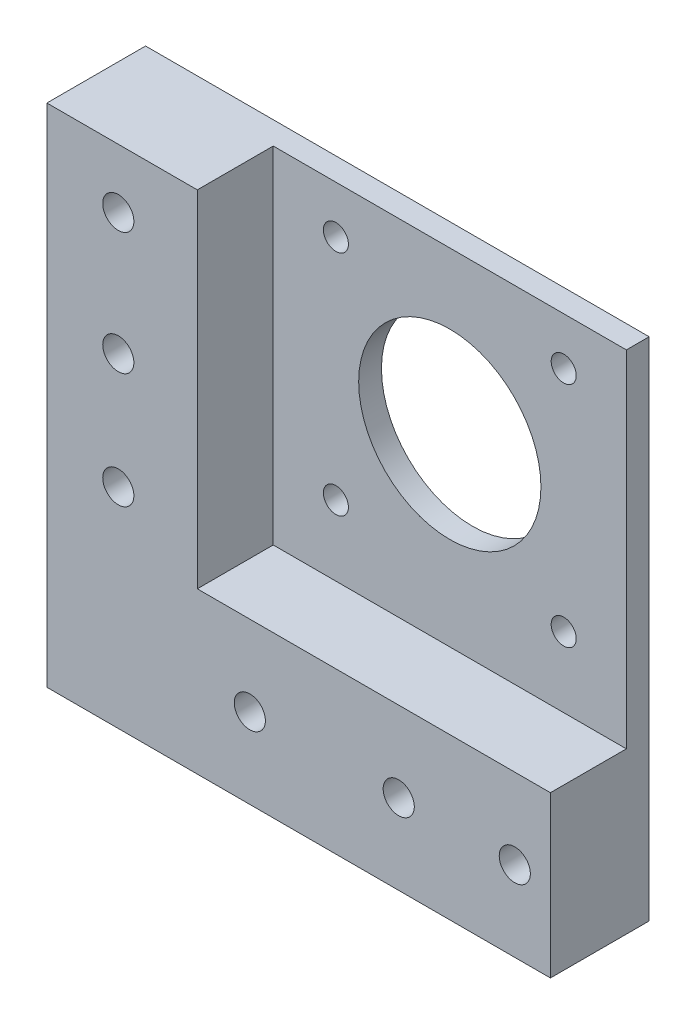
ISO-10303-21;
HEADER;
FILE_DESCRIPTION(('STEP AP214'),'2;1');
FILE_NAME('part.step','',(''),(''),'','','');
FILE_SCHEMA(('AUTOMOTIVE_DESIGN { 1 0 10303 214 1 1 1 1 }'));
ENDSEC;
DATA;
#1=APPLICATION_CONTEXT('core data for automotive mechanical design processes');
#2=APPLICATION_PROTOCOL_DEFINITION('international standard','automotive_design',2000,#1);
#3=PRODUCT_CONTEXT('',#1,'mechanical');
#4=PRODUCT('Part','Part','',(#3));
#5=PRODUCT_RELATED_PRODUCT_CATEGORY('part','',(#4));
#6=PRODUCT_DEFINITION_FORMATION('','',#4);
#7=PRODUCT_DEFINITION_CONTEXT('part definition',#1,'design');
#8=PRODUCT_DEFINITION('design','',#6,#7);
#9=PRODUCT_DEFINITION_SHAPE('','',#8);
#10=(LENGTH_UNIT() NAMED_UNIT(*) SI_UNIT(.MILLI.,.METRE.));
#11=(NAMED_UNIT(*) PLANE_ANGLE_UNIT() SI_UNIT($,.RADIAN.));
#12=(NAMED_UNIT(*) SI_UNIT($,.STERADIAN.) SOLID_ANGLE_UNIT());
#13=UNCERTAINTY_MEASURE_WITH_UNIT(LENGTH_MEASURE(1.E-05),#10,'distance_accuracy_value','');
#14=(GEOMETRIC_REPRESENTATION_CONTEXT(3) GLOBAL_UNCERTAINTY_ASSIGNED_CONTEXT((#13)) GLOBAL_UNIT_ASSIGNED_CONTEXT((#10,
#11,#12)) REPRESENTATION_CONTEXT('',''));
#15=CARTESIAN_POINT('',(0.,0.,0.));
#16=DIRECTION('',(0.,0.,1.));
#17=DIRECTION('',(1.,0.,0.));
#18=AXIS2_PLACEMENT_3D('',#15,#16,#17);
#19=CARTESIAN_POINT('',(0.,3.,0.));
#20=DIRECTION('',(1.,0.,0.));
#21=DIRECTION('',(0.,0.,1.));
#22=AXIS2_PLACEMENT_3D('',#19,#20,#21);
#23=PLANE('',#22);
#24=DIRECTION('',(0.,0.,1.));
#25=VECTOR('',#24,1.);
#26=CARTESIAN_POINT('',(0.,45.5,0.));
#27=LINE('',#26,#25);
#28=CARTESIAN_POINT('',(0.,45.5,-3.));
#29=VERTEX_POINT('',#28);
#30=CARTESIAN_POINT('',(0.,45.5,0.));
#31=VERTEX_POINT('',#30);
#32=EDGE_CURVE('E111',#29,#31,#27,.T.);
#33=ORIENTED_EDGE('',*,*,#32,.T.);
#34=DIRECTION('',(0.,-1.,0.));
#35=VECTOR('',#34,1.);
#36=CARTESIAN_POINT('',(0.,3.,0.));
#37=LINE('',#36,#35);
#38=CARTESIAN_POINT('',(0.,0.,0.));
#39=VERTEX_POINT('',#38);
#40=EDGE_CURVE('E11',#31,#39,#37,.T.);
#41=ORIENTED_EDGE('',*,*,#40,.T.);
#42=DIRECTION('',(0.,0.,1.));
#43=VECTOR('',#42,1.);
#44=CARTESIAN_POINT('',(0.,0.,-3.));
#45=LINE('',#44,#43);
#46=CARTESIAN_POINT('',(0.,0.,10.));
#47=VERTEX_POINT('',#46);
#48=EDGE_CURVE('E176',#39,#47,#45,.T.);
#49=ORIENTED_EDGE('',*,*,#48,.T.);
#50=DIRECTION('',(0.,-1.,0.));
#51=VECTOR('',#50,1.);
#52=CARTESIAN_POINT('',(0.,0.,10.));
#53=LINE('',#52,#51);
#54=CARTESIAN_POINT('',(0.,-21.1335669329671,10.));
#55=VERTEX_POINT('',#54);
#56=EDGE_CURVE('E206',#47,#55,#53,.T.);
#57=ORIENTED_EDGE('',*,*,#56,.T.);
#58=DIRECTION('',(0.,0.,1.));
#59=VECTOR('',#58,1.);
#60=CARTESIAN_POINT('',(0.,-21.1335669329671,-3.));
#61=LINE('',#60,#59);
#62=CARTESIAN_POINT('',(0.,-21.1335669329671,-3.));
#63=VERTEX_POINT('',#62);
#64=EDGE_CURVE('E113',#63,#55,#61,.T.);
#65=ORIENTED_EDGE('',*,*,#64,.F.);
#66=DIRECTION('',(0.,-1.,0.));
#67=VECTOR('',#66,1.);
#68=CARTESIAN_POINT('',(0.,0.,-3.));
#69=LINE('',#68,#67);
#70=EDGE_CURVE('E102',#29,#63,#69,.T.);
#71=ORIENTED_EDGE('',*,*,#70,.F.);
#72=EDGE_LOOP('',(#33,#41,#49,#57,#65,#71));
#73=FACE_BOUND('',#72,.T.);
#74=ADVANCED_FACE('F39',(#73),#23,.T.);
#75=CARTESIAN_POINT('',(0.,45.5,0.));
#76=DIRECTION('',(0.,1.,0.));
#77=DIRECTION('',(0.,0.,1.));
#78=AXIS2_PLACEMENT_3D('',#75,#76,#77);
#79=PLANE('',#78);
#80=DIRECTION('',(0.,0.,1.));
#81=VECTOR('',#80,1.);
#82=CARTESIAN_POINT('',(-66.3112991356769,45.5,-3.));
#83=LINE('',#82,#81);
#84=CARTESIAN_POINT('',(-66.3112991356769,45.5,-3.));
#85=VERTEX_POINT('',#84);
#86=CARTESIAN_POINT('',(-66.3112991356769,45.5,10.));
#87=VERTEX_POINT('',#86);
#88=EDGE_CURVE('E133',#85,#87,#83,.T.);
#89=ORIENTED_EDGE('',*,*,#88,.T.);
#90=DIRECTION('',(-1.,0.,0.));
#91=VECTOR('',#90,1.);
#92=CARTESIAN_POINT('',(0.,45.5,10.));
#93=LINE('',#92,#91);
#94=CARTESIAN_POINT('',(-46.5,45.5,10.));
#95=VERTEX_POINT('',#94);
#96=EDGE_CURVE('E213',#95,#87,#93,.T.);
#97=ORIENTED_EDGE('',*,*,#96,.F.);
#98=DIRECTION('',(0.,0.,1.));
#99=VECTOR('',#98,1.);
#100=CARTESIAN_POINT('',(-46.5,45.5,-3.));
#101=LINE('',#100,#99);
#102=CARTESIAN_POINT('',(-46.5,45.5,0.));
#103=VERTEX_POINT('',#102);
#104=EDGE_CURVE('E180',#103,#95,#101,.T.);
#105=ORIENTED_EDGE('',*,*,#104,.F.);
#106=DIRECTION('',(-1.,0.,0.));
#107=VECTOR('',#106,1.);
#108=CARTESIAN_POINT('',(0.,45.5,0.));
#109=LINE('',#108,#107);
#110=EDGE_CURVE('E46',#31,#103,#109,.T.);
#111=ORIENTED_EDGE('',*,*,#110,.F.);
#112=ORIENTED_EDGE('',*,*,#32,.F.);
#113=DIRECTION('',(-1.,0.,0.));
#114=VECTOR('',#113,1.);
#115=CARTESIAN_POINT('',(0.,45.5,-3.));
#116=LINE('',#115,#114);
#117=EDGE_CURVE('E98',#29,#85,#116,.T.);
#118=ORIENTED_EDGE('',*,*,#117,.T.);
#119=EDGE_LOOP('',(#89,#97,#105,#111,#112,#118));
#120=FACE_BOUND('',#119,.T.);
#121=ADVANCED_FACE('F115',(#120),#79,.T.);
#122=CARTESIAN_POINT('',(0.,3.,0.));
#123=DIRECTION('',(0.,0.,1.));
#124=DIRECTION('',(-1.,0.,0.));
#125=AXIS2_PLACEMENT_3D('',#122,#123,#124);
#126=PLANE('',#125);
#127=CARTESIAN_POINT('',(-8.25000000000007,9.24999999999999,0.));
#128=DIRECTION('',(0.,0.,-1.));
#129=DIRECTION('',(-1.,0.,0.));
#130=AXIS2_PLACEMENT_3D('',#127,#128,#129);
#131=CIRCLE('',#130,1.65);
#132=CARTESIAN_POINT('',(-9.90000000000007,9.24999999999999,0.));
#133=VERTEX_POINT('',#132);
#134=EDGE_CURVE('E119',#133,#133,#131,.T.);
#135=ORIENTED_EDGE('',*,*,#134,.T.);
#136=EDGE_LOOP('',(#135));
#137=FACE_BOUND('',#136,.T.);
#138=CARTESIAN_POINT('',(-8.25000000000007,39.25,0.));
#139=DIRECTION('',(0.,0.,-1.));
#140=DIRECTION('',(-1.,0.,0.));
#141=AXIS2_PLACEMENT_3D('',#138,#139,#140);
#142=CIRCLE('',#141,1.65);
#143=CARTESIAN_POINT('',(-9.90000000000007,39.25,0.));
#144=VERTEX_POINT('',#143);
#145=EDGE_CURVE('E128',#144,#144,#142,.T.);
#146=ORIENTED_EDGE('',*,*,#145,.T.);
#147=EDGE_LOOP('',(#146));
#148=FACE_BOUND('',#147,.T.);
#149=CARTESIAN_POINT('',(-38.25,39.25,0.));
#150=DIRECTION('',(0.,0.,-1.));
#151=DIRECTION('',(-1.,0.,0.));
#152=AXIS2_PLACEMENT_3D('',#149,#150,#151);
#153=CIRCLE('',#152,1.65);
#154=CARTESIAN_POINT('',(-39.9,39.25,0.));
#155=VERTEX_POINT('',#154);
#156=EDGE_CURVE('E125',#155,#155,#153,.T.);
#157=ORIENTED_EDGE('',*,*,#156,.T.);
#158=EDGE_LOOP('',(#157));
#159=FACE_BOUND('',#158,.T.);
#160=CARTESIAN_POINT('',(-38.2500000000001,9.24999999999999,0.));
#161=DIRECTION('',(0.,0.,-1.));
#162=DIRECTION('',(-1.,0.,0.));
#163=AXIS2_PLACEMENT_3D('',#160,#161,#162);
#164=CIRCLE('',#163,1.65);
#165=CARTESIAN_POINT('',(-39.9000000000001,9.24999999999999,0.));
#166=VERTEX_POINT('',#165);
#167=EDGE_CURVE('E122',#166,#166,#164,.T.);
#168=ORIENTED_EDGE('',*,*,#167,.T.);
#169=EDGE_LOOP('',(#168));
#170=FACE_BOUND('',#169,.T.);
#171=CARTESIAN_POINT('',(-23.25,24.25,0.));
#172=DIRECTION('',(0.,0.,-1.));
#173=DIRECTION('',(-1.,0.,0.));
#174=AXIS2_PLACEMENT_3D('',#171,#172,#173);
#175=CIRCLE('',#174,12.);
#176=CARTESIAN_POINT('',(-35.25,24.25,0.));
#177=VERTEX_POINT('',#176);
#178=EDGE_CURVE('E116',#177,#177,#175,.T.);
#179=ORIENTED_EDGE('',*,*,#178,.T.);
#180=EDGE_LOOP('',(#179));
#181=FACE_BOUND('',#180,.T.);
#182=ORIENTED_EDGE('',*,*,#40,.F.);
#183=ORIENTED_EDGE('',*,*,#110,.T.);
#184=DIRECTION('',(0.,1.,0.));
#185=VECTOR('',#184,1.);
#186=CARTESIAN_POINT('',(-46.5,3.,0.));
#187=LINE('',#186,#185);
#188=CARTESIAN_POINT('',(-46.5,0.,0.));
#189=VERTEX_POINT('',#188);
#190=EDGE_CURVE('E174',#189,#103,#187,.T.);
#191=ORIENTED_EDGE('',*,*,#190,.F.);
#192=DIRECTION('',(-1.,0.,0.));
#193=VECTOR('',#192,1.);
#194=CARTESIAN_POINT('',(0.,0.,0.));
#195=LINE('',#194,#193);
#196=EDGE_CURVE('E171',#39,#189,#195,.T.);
#197=ORIENTED_EDGE('',*,*,#196,.F.);
#198=EDGE_LOOP('',(#182,#183,#191,#197));
#199=FACE_BOUND('',#198,.T.);
#200=ADVANCED_FACE('F232',(#137,#148,#159,#170,#181,#199),#126,.T.);
#201=CARTESIAN_POINT('',(-23.25,24.25,-40.));
#202=DIRECTION('',(0.,0.,1.));
#203=DIRECTION('',(-1.,0.,0.));
#204=AXIS2_PLACEMENT_3D('',#201,#202,#203);
#205=CYLINDRICAL_SURFACE('',#204,12.);
#206=ORIENTED_EDGE('',*,*,#178,.F.);
#207=EDGE_LOOP('',(#206));
#208=FACE_BOUND('',#207,.T.);
#209=CARTESIAN_POINT('',(-23.25,24.25,-3.));
#210=DIRECTION('',(0.,0.,-1.));
#211=DIRECTION('',(-1.,0.,0.));
#212=AXIS2_PLACEMENT_3D('',#209,#210,#211);
#213=CIRCLE('',#212,12.);
#214=CARTESIAN_POINT('',(-35.25,24.25,-3.));
#215=VERTEX_POINT('',#214);
#216=EDGE_CURVE('E151',#215,#215,#213,.F.);
#217=ORIENTED_EDGE('',*,*,#216,.F.);
#218=EDGE_LOOP('',(#217));
#219=FACE_BOUND('',#218,.T.);
#220=ADVANCED_FACE('F256',(#208,#219),#205,.F.);
#221=CARTESIAN_POINT('',(-38.2500000000001,9.24999999999999,-40.));
#222=DIRECTION('',(0.,0.,1.));
#223=DIRECTION('',(-1.,0.,0.));
#224=AXIS2_PLACEMENT_3D('',#221,#222,#223);
#225=CYLINDRICAL_SURFACE('',#224,1.65);
#226=ORIENTED_EDGE('',*,*,#167,.F.);
#227=EDGE_LOOP('',(#226));
#228=FACE_BOUND('',#227,.T.);
#229=CARTESIAN_POINT('',(-38.2500000000001,9.24999999999999,-3.));
#230=DIRECTION('',(0.,0.,-1.));
#231=DIRECTION('',(-1.,0.,0.));
#232=AXIS2_PLACEMENT_3D('',#229,#230,#231);
#233=CIRCLE('',#232,1.65);
#234=CARTESIAN_POINT('',(-39.9000000000001,9.24999999999999,-3.));
#235=VERTEX_POINT('',#234);
#236=EDGE_CURVE('E154',#235,#235,#233,.F.);
#237=ORIENTED_EDGE('',*,*,#236,.F.);
#238=EDGE_LOOP('',(#237));
#239=FACE_BOUND('',#238,.T.);
#240=ADVANCED_FACE('F261',(#228,#239),#225,.F.);
#241=CARTESIAN_POINT('',(-38.25,39.25,-40.));
#242=DIRECTION('',(0.,0.,1.));
#243=DIRECTION('',(-1.,0.,0.));
#244=AXIS2_PLACEMENT_3D('',#241,#242,#243);
#245=CYLINDRICAL_SURFACE('',#244,1.65);
#246=ORIENTED_EDGE('',*,*,#156,.F.);
#247=EDGE_LOOP('',(#246));
#248=FACE_BOUND('',#247,.T.);
#249=CARTESIAN_POINT('',(-38.25,39.25,-3.));
#250=DIRECTION('',(0.,0.,-1.));
#251=DIRECTION('',(-1.,0.,0.));
#252=AXIS2_PLACEMENT_3D('',#249,#250,#251);
#253=CIRCLE('',#252,1.65);
#254=CARTESIAN_POINT('',(-39.9,39.25,-3.));
#255=VERTEX_POINT('',#254);
#256=EDGE_CURVE('E148',#255,#255,#253,.F.);
#257=ORIENTED_EDGE('',*,*,#256,.F.);
#258=EDGE_LOOP('',(#257));
#259=FACE_BOUND('',#258,.T.);
#260=ADVANCED_FACE('F265',(#248,#259),#245,.F.);
#261=CARTESIAN_POINT('',(-8.25000000000007,39.25,-40.));
#262=DIRECTION('',(0.,0.,1.));
#263=DIRECTION('',(-1.,0.,0.));
#264=AXIS2_PLACEMENT_3D('',#261,#262,#263);
#265=CYLINDRICAL_SURFACE('',#264,1.65);
#266=ORIENTED_EDGE('',*,*,#145,.F.);
#267=EDGE_LOOP('',(#266));
#268=FACE_BOUND('',#267,.T.);
#269=CARTESIAN_POINT('',(-8.25000000000007,39.25,-3.));
#270=DIRECTION('',(0.,0.,-1.));
#271=DIRECTION('',(-1.,0.,0.));
#272=AXIS2_PLACEMENT_3D('',#269,#270,#271);
#273=CIRCLE('',#272,1.65);
#274=CARTESIAN_POINT('',(-9.90000000000007,39.25,-3.));
#275=VERTEX_POINT('',#274);
#276=EDGE_CURVE('E157',#275,#275,#273,.F.);
#277=ORIENTED_EDGE('',*,*,#276,.F.);
#278=EDGE_LOOP('',(#277));
#279=FACE_BOUND('',#278,.T.);
#280=ADVANCED_FACE('F269',(#268,#279),#265,.F.);
#281=CARTESIAN_POINT('',(-8.25000000000007,9.24999999999999,-40.));
#282=DIRECTION('',(0.,0.,1.));
#283=DIRECTION('',(-1.,0.,0.));
#284=AXIS2_PLACEMENT_3D('',#281,#282,#283);
#285=CYLINDRICAL_SURFACE('',#284,1.65);
#286=ORIENTED_EDGE('',*,*,#134,.F.);
#287=EDGE_LOOP('',(#286));
#288=FACE_BOUND('',#287,.T.);
#289=CARTESIAN_POINT('',(-8.25000000000007,9.24999999999999,-3.));
#290=DIRECTION('',(0.,0.,-1.));
#291=DIRECTION('',(-1.,0.,0.));
#292=AXIS2_PLACEMENT_3D('',#289,#290,#291);
#293=CIRCLE('',#292,1.65);
#294=CARTESIAN_POINT('',(-9.90000000000007,9.24999999999999,-3.));
#295=VERTEX_POINT('',#294);
#296=EDGE_CURVE('E145',#295,#295,#293,.F.);
#297=ORIENTED_EDGE('',*,*,#296,.F.);
#298=EDGE_LOOP('',(#297));
#299=FACE_BOUND('',#298,.T.);
#300=ADVANCED_FACE('F273',(#288,#299),#285,.F.);
#301=CARTESIAN_POINT('',(0.,0.,-3.));
#302=DIRECTION('',(0.,0.,1.));
#303=DIRECTION('',(-1.,0.,0.));
#304=AXIS2_PLACEMENT_3D('',#301,#302,#303);
#305=PLANE('',#304);
#306=CARTESIAN_POINT('',(-39.5824358543138,-10.5667834664835,-3.));
#307=DIRECTION('',(0.,0.,-1.));
#308=DIRECTION('',(-1.,0.,0.));
#309=AXIS2_PLACEMENT_3D('',#306,#307,#308);
#310=CIRCLE('',#309,2.04999999999999);
#311=CARTESIAN_POINT('',(-41.6324358543138,-10.5667834664835,-3.));
#312=VERTEX_POINT('',#311);
#313=EDGE_CURVE('E135',#312,#312,#310,.T.);
#314=ORIENTED_EDGE('',*,*,#313,.F.);
#315=EDGE_LOOP('',(#314));
#316=FACE_BOUND('',#315,.T.);
#317=CARTESIAN_POINT('',(-4.69126171678624,-10.5667834664835,-3.));
#318=DIRECTION('',(0.,0.,-1.));
#319=DIRECTION('',(-1.,0.,0.));
#320=AXIS2_PLACEMENT_3D('',#317,#318,#319);
#321=CIRCLE('',#320,2.05);
#322=CARTESIAN_POINT('',(-6.74126171678624,-10.5667834664835,-3.));
#323=VERTEX_POINT('',#322);
#324=EDGE_CURVE('E139',#323,#323,#321,.T.);
#325=ORIENTED_EDGE('',*,*,#324,.F.);
#326=EDGE_LOOP('',(#325));
#327=FACE_BOUND('',#326,.T.);
#328=CARTESIAN_POINT('',(-19.9769249937987,-10.5667834664835,-3.));
#329=DIRECTION('',(0.,0.,-1.));
#330=DIRECTION('',(-1.,0.,0.));
#331=AXIS2_PLACEMENT_3D('',#328,#329,#330);
#332=CIRCLE('',#331,2.05);
#333=CARTESIAN_POINT('',(-22.0269249937987,-10.5667834664835,-3.));
#334=VERTEX_POINT('',#333);
#335=EDGE_CURVE('E142',#334,#334,#332,.T.);
#336=ORIENTED_EDGE('',*,*,#335,.F.);
#337=EDGE_LOOP('',(#336));
#338=FACE_BOUND('',#337,.T.);
#339=ORIENTED_EDGE('',*,*,#70,.T.);
#340=DIRECTION('',(1.,0.,0.));
#341=VECTOR('',#340,1.);
#342=CARTESIAN_POINT('',(0.,-21.1335669329671,-3.));
#343=LINE('',#342,#341);
#344=CARTESIAN_POINT('',(-66.3112991356769,-21.1335669329671,-3.));
#345=VERTEX_POINT('',#344);
#346=EDGE_CURVE('E60',#345,#63,#343,.T.);
#347=ORIENTED_EDGE('',*,*,#346,.F.);
#348=DIRECTION('',(0.,-1.,0.));
#349=VECTOR('',#348,1.);
#350=CARTESIAN_POINT('',(-66.3112991356769,0.,-3.));
#351=LINE('',#350,#349);
#352=EDGE_CURVE('E105',#85,#345,#351,.T.);
#353=ORIENTED_EDGE('',*,*,#352,.F.);
#354=ORIENTED_EDGE('',*,*,#117,.F.);
#355=EDGE_LOOP('',(#339,#347,#353,#354));
#356=FACE_BOUND('',#355,.T.);
#357=CARTESIAN_POINT('',(-56.9030733555991,21.6094458305065,-3.));
#358=DIRECTION('',(0.,0.,-1.));
#359=DIRECTION('',(-1.,0.,0.));
#360=AXIS2_PLACEMENT_3D('',#357,#358,#359);
#361=CIRCLE('',#360,2.04999999999999);
#362=CARTESIAN_POINT('',(-58.9530733555991,21.6094458305065,-3.));
#363=VERTEX_POINT('',#362);
#364=EDGE_CURVE('E168',#363,#363,#361,.T.);
#365=ORIENTED_EDGE('',*,*,#364,.F.);
#366=EDGE_LOOP('',(#365));
#367=FACE_BOUND('',#366,.T.);
#368=CARTESIAN_POINT('',(-56.9030733555991,6.42969754154166,-3.));
#369=DIRECTION('',(0.,0.,-1.));
#370=DIRECTION('',(-1.,0.,0.));
#371=AXIS2_PLACEMENT_3D('',#368,#369,#370);
#372=CIRCLE('',#371,2.04999999999999);
#373=CARTESIAN_POINT('',(-58.9530733555991,6.42969754154166,-3.));
#374=VERTEX_POINT('',#373);
#375=EDGE_CURVE('E165',#374,#374,#372,.T.);
#376=ORIENTED_EDGE('',*,*,#375,.F.);
#377=EDGE_LOOP('',(#376));
#378=FACE_BOUND('',#377,.T.);
#379=CARTESIAN_POINT('',(-56.9030733555991,37.7215889065994,-3.));
#380=DIRECTION('',(0.,0.,-1.));
#381=DIRECTION('',(-1.,0.,0.));
#382=AXIS2_PLACEMENT_3D('',#379,#380,#381);
#383=CIRCLE('',#382,2.04999999999999);
#384=CARTESIAN_POINT('',(-58.9530733555991,37.7215889065994,-3.));
#385=VERTEX_POINT('',#384);
#386=EDGE_CURVE('E162',#385,#385,#383,.T.);
#387=ORIENTED_EDGE('',*,*,#386,.F.);
#388=EDGE_LOOP('',(#387));
#389=FACE_BOUND('',#388,.T.);
#390=ORIENTED_EDGE('',*,*,#296,.T.);
#391=EDGE_LOOP('',(#390));
#392=FACE_BOUND('',#391,.T.);
#393=ORIENTED_EDGE('',*,*,#256,.T.);
#394=EDGE_LOOP('',(#393));
#395=FACE_BOUND('',#394,.T.);
#396=ORIENTED_EDGE('',*,*,#216,.T.);
#397=EDGE_LOOP('',(#396));
#398=FACE_BOUND('',#397,.T.);
#399=ORIENTED_EDGE('',*,*,#236,.T.);
#400=EDGE_LOOP('',(#399));
#401=FACE_BOUND('',#400,.T.);
#402=ORIENTED_EDGE('',*,*,#276,.T.);
#403=EDGE_LOOP('',(#402));
#404=FACE_BOUND('',#403,.T.);
#405=ADVANCED_FACE('F100',(#316,#327,#338,#356,#367,#378,#389,#392,#395,#398,#401,#404),#305,.F.);
#406=CARTESIAN_POINT('',(-66.3112991356769,0.,-3.));
#407=DIRECTION('',(1.,0.,0.));
#408=DIRECTION('',(0.,0.,1.));
#409=AXIS2_PLACEMENT_3D('',#406,#407,#408);
#410=PLANE('',#409);
#411=ORIENTED_EDGE('',*,*,#88,.F.);
#412=ORIENTED_EDGE('',*,*,#352,.T.);
#413=DIRECTION('',(0.,0.,1.));
#414=VECTOR('',#413,1.);
#415=CARTESIAN_POINT('',(-66.3112991356769,-21.1335669329671,-3.));
#416=LINE('',#415,#414);
#417=CARTESIAN_POINT('',(-66.3112991356769,-21.1335669329671,10.));
#418=VERTEX_POINT('',#417);
#419=EDGE_CURVE('E177',#345,#418,#416,.T.);
#420=ORIENTED_EDGE('',*,*,#419,.T.);
#421=DIRECTION('',(0.,1.,0.));
#422=VECTOR('',#421,1.);
#423=CARTESIAN_POINT('',(-66.3112991356769,0.,10.));
#424=LINE('',#423,#422);
#425=EDGE_CURVE('E216',#418,#87,#424,.T.);
#426=ORIENTED_EDGE('',*,*,#425,.T.);
#427=EDGE_LOOP('',(#411,#412,#420,#426));
#428=FACE_BOUND('',#427,.T.);
#429=ADVANCED_FACE('F227',(#428),#410,.F.);
#430=CARTESIAN_POINT('',(0.,-21.1335669329671,-3.));
#431=DIRECTION('',(0.,1.,0.));
#432=DIRECTION('',(0.,0.,1.));
#433=AXIS2_PLACEMENT_3D('',#430,#431,#432);
#434=PLANE('',#433);
#435=DIRECTION('',(-1.,0.,0.));
#436=VECTOR('',#435,1.);
#437=CARTESIAN_POINT('',(0.,-21.1335669329671,10.));
#438=LINE('',#437,#436);
#439=EDGE_CURVE('E218',#55,#418,#438,.T.);
#440=ORIENTED_EDGE('',*,*,#439,.T.);
#441=ORIENTED_EDGE('',*,*,#419,.F.);
#442=ORIENTED_EDGE('',*,*,#346,.T.);
#443=ORIENTED_EDGE('',*,*,#64,.T.);
#444=EDGE_LOOP('',(#440,#441,#442,#443));
#445=FACE_BOUND('',#444,.T.);
#446=ADVANCED_FACE('F220',(#445),#434,.F.);
#447=CARTESIAN_POINT('',(-4.69126171678624,-10.5667834664835,-3.));
#448=DIRECTION('',(0.,0.,1.));
#449=DIRECTION('',(-1.,0.,0.));
#450=AXIS2_PLACEMENT_3D('',#447,#448,#449);
#451=CYLINDRICAL_SURFACE('',#450,2.05);
#452=ORIENTED_EDGE('',*,*,#324,.T.);
#453=EDGE_LOOP('',(#452));
#454=FACE_BOUND('',#453,.T.);
#455=CARTESIAN_POINT('',(-4.69126171678624,-10.5667834664835,10.));
#456=DIRECTION('',(0.,0.,-1.));
#457=DIRECTION('',(-1.,0.,0.));
#458=AXIS2_PLACEMENT_3D('',#455,#456,#457);
#459=CIRCLE('',#458,2.05);
#460=CARTESIAN_POINT('',(-6.74126171678624,-10.5667834664835,10.));
#461=VERTEX_POINT('',#460);
#462=EDGE_CURVE('E200',#461,#461,#459,.T.);
#463=ORIENTED_EDGE('',*,*,#462,.F.);
#464=EDGE_LOOP('',(#463));
#465=FACE_BOUND('',#464,.T.);
#466=ADVANCED_FACE('F294',(#454,#465),#451,.F.);
#467=CARTESIAN_POINT('',(-19.9769249937987,-10.5667834664835,-3.));
#468=DIRECTION('',(0.,0.,1.));
#469=DIRECTION('',(-1.,0.,0.));
#470=AXIS2_PLACEMENT_3D('',#467,#468,#469);
#471=CYLINDRICAL_SURFACE('',#470,2.05);
#472=ORIENTED_EDGE('',*,*,#335,.T.);
#473=EDGE_LOOP('',(#472));
#474=FACE_BOUND('',#473,.T.);
#475=CARTESIAN_POINT('',(-19.9769249937987,-10.5667834664835,10.));
#476=DIRECTION('',(0.,0.,-1.));
#477=DIRECTION('',(-1.,0.,0.));
#478=AXIS2_PLACEMENT_3D('',#475,#476,#477);
#479=CIRCLE('',#478,2.05);
#480=CARTESIAN_POINT('',(-22.0269249937987,-10.5667834664835,10.));
#481=VERTEX_POINT('',#480);
#482=EDGE_CURVE('E203',#481,#481,#479,.T.);
#483=ORIENTED_EDGE('',*,*,#482,.F.);
#484=EDGE_LOOP('',(#483));
#485=FACE_BOUND('',#484,.T.);
#486=ADVANCED_FACE('F288',(#474,#485),#471,.F.);
#487=CARTESIAN_POINT('',(-56.9030733555991,37.7215889065994,-3.));
#488=DIRECTION('',(0.,0.,1.));
#489=DIRECTION('',(-1.,0.,0.));
#490=AXIS2_PLACEMENT_3D('',#487,#488,#489);
#491=CYLINDRICAL_SURFACE('',#490,2.04999999999999);
#492=ORIENTED_EDGE('',*,*,#386,.T.);
#493=EDGE_LOOP('',(#492));
#494=FACE_BOUND('',#493,.T.);
#495=CARTESIAN_POINT('',(-56.9030733555991,37.7215889065994,10.));
#496=DIRECTION('',(0.,0.,-1.));
#497=DIRECTION('',(-1.,0.,0.));
#498=AXIS2_PLACEMENT_3D('',#495,#496,#497);
#499=CIRCLE('',#498,2.04999999999999);
#500=CARTESIAN_POINT('',(-58.9530733555991,37.7215889065994,10.));
#501=VERTEX_POINT('',#500);
#502=EDGE_CURVE('E181',#501,#501,#499,.T.);
#503=ORIENTED_EDGE('',*,*,#502,.F.);
#504=EDGE_LOOP('',(#503));
#505=FACE_BOUND('',#504,.T.);
#506=ADVANCED_FACE('F284',(#494,#505),#491,.F.);
#507=CARTESIAN_POINT('',(-56.9030733555991,6.42969754154166,-3.));
#508=DIRECTION('',(0.,0.,1.));
#509=DIRECTION('',(-1.,0.,0.));
#510=AXIS2_PLACEMENT_3D('',#507,#508,#509);
#511=CYLINDRICAL_SURFACE('',#510,2.04999999999999);
#512=ORIENTED_EDGE('',*,*,#375,.T.);
#513=EDGE_LOOP('',(#512));
#514=FACE_BOUND('',#513,.T.);
#515=CARTESIAN_POINT('',(-56.9030733555991,6.42969754154166,10.));
#516=DIRECTION('',(0.,0.,-1.));
#517=DIRECTION('',(-1.,0.,0.));
#518=AXIS2_PLACEMENT_3D('',#515,#516,#517);
#519=CIRCLE('',#518,2.04999999999999);
#520=CARTESIAN_POINT('',(-58.9530733555991,6.42969754154166,10.));
#521=VERTEX_POINT('',#520);
#522=EDGE_CURVE('E191',#521,#521,#519,.T.);
#523=ORIENTED_EDGE('',*,*,#522,.F.);
#524=EDGE_LOOP('',(#523));
#525=FACE_BOUND('',#524,.T.);
#526=ADVANCED_FACE('F280',(#514,#525),#511,.F.);
#527=CARTESIAN_POINT('',(-56.9030733555991,21.6094458305065,-3.));
#528=DIRECTION('',(0.,0.,1.));
#529=DIRECTION('',(-1.,0.,0.));
#530=AXIS2_PLACEMENT_3D('',#527,#528,#529);
#531=CYLINDRICAL_SURFACE('',#530,2.04999999999999);
#532=ORIENTED_EDGE('',*,*,#364,.T.);
#533=EDGE_LOOP('',(#532));
#534=FACE_BOUND('',#533,.T.);
#535=CARTESIAN_POINT('',(-56.9030733555991,21.6094458305065,10.));
#536=DIRECTION('',(0.,0.,-1.));
#537=DIRECTION('',(-1.,0.,0.));
#538=AXIS2_PLACEMENT_3D('',#535,#536,#537);
#539=CIRCLE('',#538,2.04999999999999);
#540=CARTESIAN_POINT('',(-58.9530733555991,21.6094458305065,10.));
#541=VERTEX_POINT('',#540);
#542=EDGE_CURVE('E194',#541,#541,#539,.T.);
#543=ORIENTED_EDGE('',*,*,#542,.F.);
#544=EDGE_LOOP('',(#543));
#545=FACE_BOUND('',#544,.T.);
#546=ADVANCED_FACE('F244',(#534,#545),#531,.F.);
#547=CARTESIAN_POINT('',(-39.5824358543138,-10.5667834664835,-3.));
#548=DIRECTION('',(0.,0.,1.));
#549=DIRECTION('',(-1.,0.,0.));
#550=AXIS2_PLACEMENT_3D('',#547,#548,#549);
#551=CYLINDRICAL_SURFACE('',#550,2.04999999999999);
#552=ORIENTED_EDGE('',*,*,#313,.T.);
#553=EDGE_LOOP('',(#552));
#554=FACE_BOUND('',#553,.T.);
#555=CARTESIAN_POINT('',(-39.5824358543138,-10.5667834664835,10.));
#556=DIRECTION('',(0.,0.,-1.));
#557=DIRECTION('',(-1.,0.,0.));
#558=AXIS2_PLACEMENT_3D('',#555,#556,#557);
#559=CIRCLE('',#558,2.04999999999999);
#560=CARTESIAN_POINT('',(-41.6324358543138,-10.5667834664835,10.));
#561=VERTEX_POINT('',#560);
#562=EDGE_CURVE('E197',#561,#561,#559,.T.);
#563=ORIENTED_EDGE('',*,*,#562,.F.);
#564=EDGE_LOOP('',(#563));
#565=FACE_BOUND('',#564,.T.);
#566=ADVANCED_FACE('F237',(#554,#565),#551,.F.);
#567=CARTESIAN_POINT('',(0.,0.,-3.));
#568=DIRECTION('',(0.,-1.,0.));
#569=DIRECTION('',(0.,0.,-1.));
#570=AXIS2_PLACEMENT_3D('',#567,#568,#569);
#571=PLANE('',#570);
#572=ORIENTED_EDGE('',*,*,#196,.T.);
#573=DIRECTION('',(0.,0.,1.));
#574=VECTOR('',#573,1.);
#575=CARTESIAN_POINT('',(-46.5,0.,-3.));
#576=LINE('',#575,#574);
#577=CARTESIAN_POINT('',(-46.5,0.,10.));
#578=VERTEX_POINT('',#577);
#579=EDGE_CURVE('E184',#189,#578,#576,.T.);
#580=ORIENTED_EDGE('',*,*,#579,.T.);
#581=DIRECTION('',(-1.,0.,0.));
#582=VECTOR('',#581,1.);
#583=CARTESIAN_POINT('',(0.,0.,10.));
#584=LINE('',#583,#582);
#585=EDGE_CURVE('E208',#47,#578,#584,.T.);
#586=ORIENTED_EDGE('',*,*,#585,.F.);
#587=ORIENTED_EDGE('',*,*,#48,.F.);
#588=EDGE_LOOP('',(#572,#580,#586,#587));
#589=FACE_BOUND('',#588,.T.);
#590=ADVANCED_FACE('F235',(#589),#571,.F.);
#591=CARTESIAN_POINT('',(-46.5,0.,-3.));
#592=DIRECTION('',(-1.,0.,0.));
#593=DIRECTION('',(0.,0.,-1.));
#594=AXIS2_PLACEMENT_3D('',#591,#592,#593);
#595=PLANE('',#594);
#596=ORIENTED_EDGE('',*,*,#190,.T.);
#597=ORIENTED_EDGE('',*,*,#104,.T.);
#598=DIRECTION('',(0.,1.,0.));
#599=VECTOR('',#598,1.);
#600=CARTESIAN_POINT('',(-46.5,0.,10.));
#601=LINE('',#600,#599);
#602=EDGE_CURVE('E211',#578,#95,#601,.T.);
#603=ORIENTED_EDGE('',*,*,#602,.F.);
#604=ORIENTED_EDGE('',*,*,#579,.F.);
#605=EDGE_LOOP('',(#596,#597,#603,#604));
#606=FACE_BOUND('',#605,.T.);
#607=ADVANCED_FACE('F229',(#606),#595,.F.);
#608=CARTESIAN_POINT('',(0.,0.,10.));
#609=DIRECTION('',(0.,0.,1.));
#610=DIRECTION('',(-1.,0.,0.));
#611=AXIS2_PLACEMENT_3D('',#608,#609,#610);
#612=PLANE('',#611);
#613=ORIENTED_EDGE('',*,*,#439,.F.);
#614=ORIENTED_EDGE('',*,*,#56,.F.);
#615=ORIENTED_EDGE('',*,*,#585,.T.);
#616=ORIENTED_EDGE('',*,*,#602,.T.);
#617=ORIENTED_EDGE('',*,*,#96,.T.);
#618=ORIENTED_EDGE('',*,*,#425,.F.);
#619=EDGE_LOOP('',(#613,#614,#615,#616,#617,#618));
#620=FACE_BOUND('',#619,.T.);
#621=ORIENTED_EDGE('',*,*,#482,.T.);
#622=EDGE_LOOP('',(#621));
#623=FACE_BOUND('',#622,.T.);
#624=ORIENTED_EDGE('',*,*,#462,.T.);
#625=EDGE_LOOP('',(#624));
#626=FACE_BOUND('',#625,.T.);
#627=ORIENTED_EDGE('',*,*,#562,.T.);
#628=EDGE_LOOP('',(#627));
#629=FACE_BOUND('',#628,.T.);
#630=ORIENTED_EDGE('',*,*,#542,.T.);
#631=EDGE_LOOP('',(#630));
#632=FACE_BOUND('',#631,.T.);
#633=ORIENTED_EDGE('',*,*,#522,.T.);
#634=EDGE_LOOP('',(#633));
#635=FACE_BOUND('',#634,.T.);
#636=ORIENTED_EDGE('',*,*,#502,.T.);
#637=EDGE_LOOP('',(#636));
#638=FACE_BOUND('',#637,.T.);
#639=ADVANCED_FACE('F223',(#620,#623,#626,#629,#632,#635,#638),#612,.T.);
#640=CLOSED_SHELL('',(#74,#121,#200,#220,#240,#260,#280,#300,#405,#429,#446,#466,#486,#506,#526,
#546,#566,#590,#607,#639));
#641=MANIFOLD_SOLID_BREP('B2',#640);
#642=ADVANCED_BREP_SHAPE_REPRESENTATION('',(#18,#641),#14);
#643=SHAPE_DEFINITION_REPRESENTATION(#9,#642);
ENDSEC;
END-ISO-10303-21;
